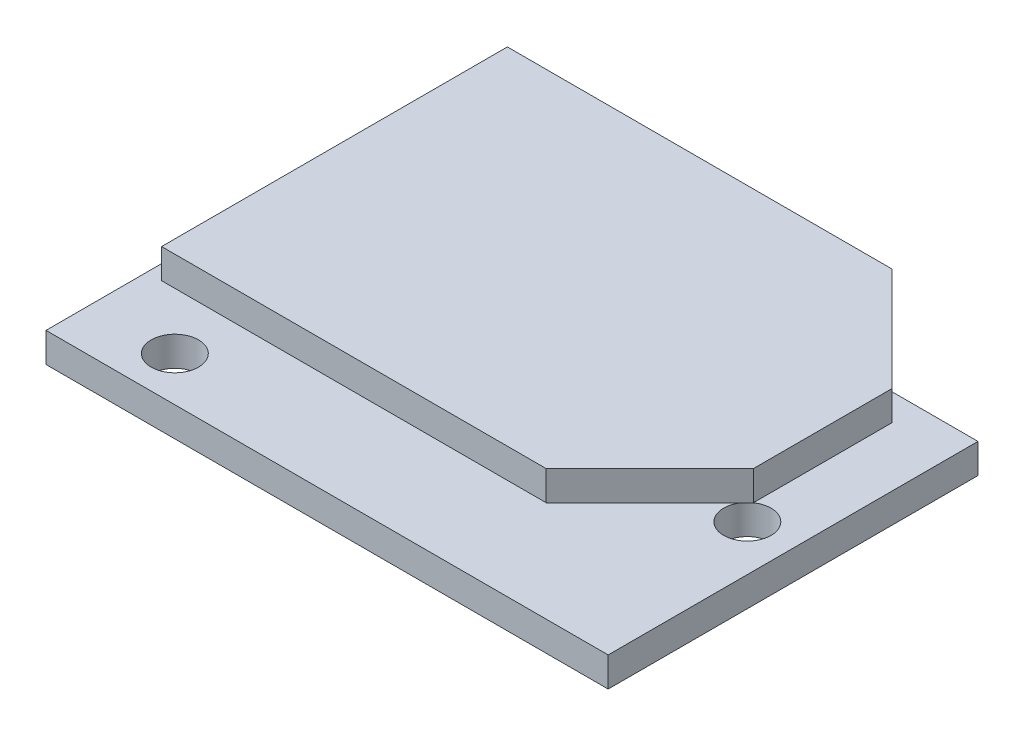
ISO-10303-21;
HEADER;
FILE_DESCRIPTION(('STEP AP214'),'2;1');
FILE_NAME('part.step','',(''),(''),'','','');
FILE_SCHEMA(('AUTOMOTIVE_DESIGN { 1 0 10303 214 1 1 1 1 }'));
ENDSEC;
DATA;
#1=APPLICATION_CONTEXT('core data for automotive mechanical design processes');
#2=APPLICATION_PROTOCOL_DEFINITION('international standard','automotive_design',2000,#1);
#3=PRODUCT_CONTEXT('',#1,'mechanical');
#4=PRODUCT('Part','Part','',(#3));
#5=PRODUCT_RELATED_PRODUCT_CATEGORY('part','',(#4));
#6=PRODUCT_DEFINITION_FORMATION('','',#4);
#7=PRODUCT_DEFINITION_CONTEXT('part definition',#1,'design');
#8=PRODUCT_DEFINITION('design','',#6,#7);
#9=PRODUCT_DEFINITION_SHAPE('','',#8);
#10=(LENGTH_UNIT() NAMED_UNIT(*) SI_UNIT(.MILLI.,.METRE.));
#11=(NAMED_UNIT(*) PLANE_ANGLE_UNIT() SI_UNIT($,.RADIAN.));
#12=(NAMED_UNIT(*) SI_UNIT($,.STERADIAN.) SOLID_ANGLE_UNIT());
#13=UNCERTAINTY_MEASURE_WITH_UNIT(LENGTH_MEASURE(1.E-05),#10,'distance_accuracy_value','');
#14=(GEOMETRIC_REPRESENTATION_CONTEXT(3) GLOBAL_UNCERTAINTY_ASSIGNED_CONTEXT((#13)) GLOBAL_UNIT_ASSIGNED_CONTEXT((#10,
#11,#12)) REPRESENTATION_CONTEXT('',''));
#15=CARTESIAN_POINT('',(0.,0.,0.));
#16=DIRECTION('',(0.,0.,1.));
#17=DIRECTION('',(1.,0.,0.));
#18=AXIS2_PLACEMENT_3D('',#15,#16,#17);
#19=CARTESIAN_POINT('',(7.,10.,-11.6864188731344));
#20=DIRECTION('',(1.,0.,0.));
#21=DIRECTION('',(0.,0.,-1.));
#22=AXIS2_PLACEMENT_3D('',#19,#20,#21);
#23=PLANE('',#22);
#24=DIRECTION('',(0.,0.,1.));
#25=VECTOR('',#24,1.);
#26=CARTESIAN_POINT('',(7.,8.,-11.6864188731344));
#27=LINE('',#26,#25);
#28=CARTESIAN_POINT('',(7.,8.,-11.6864188731344));
#29=VERTEX_POINT('',#28);
#30=CARTESIAN_POINT('',(7.,8.,11.6864188731344));
#31=VERTEX_POINT('',#30);
#32=EDGE_CURVE('E129',#29,#31,#27,.T.);
#33=ORIENTED_EDGE('',*,*,#32,.T.);
#34=DIRECTION('',(0.,-1.,0.));
#35=VECTOR('',#34,1.);
#36=CARTESIAN_POINT('',(7.,10.,11.6864188731344));
#37=LINE('',#36,#35);
#38=CARTESIAN_POINT('',(7.,10.,11.6864188731344));
#39=VERTEX_POINT('',#38);
#40=EDGE_CURVE('E12',#39,#31,#37,.T.);
#41=ORIENTED_EDGE('',*,*,#40,.F.);
#42=DIRECTION('',(0.,0.,1.));
#43=VECTOR('',#42,1.);
#44=CARTESIAN_POINT('',(7.,10.,-11.6864188731344));
#45=LINE('',#44,#43);
#46=CARTESIAN_POINT('',(7.,10.,-11.6864188731344));
#47=VERTEX_POINT('',#46);
#48=EDGE_CURVE('E139',#47,#39,#45,.T.);
#49=ORIENTED_EDGE('',*,*,#48,.F.);
#50=DIRECTION('',(0.,-1.,0.));
#51=VECTOR('',#50,1.);
#52=CARTESIAN_POINT('',(7.,10.,-11.6864188731344));
#53=LINE('',#52,#51);
#54=EDGE_CURVE('E125',#47,#29,#53,.T.);
#55=ORIENTED_EDGE('',*,*,#54,.T.);
#56=EDGE_LOOP('',(#33,#41,#49,#55));
#57=FACE_BOUND('',#56,.T.);
#58=ADVANCED_FACE('F45',(#57),#23,.F.);
#59=CARTESIAN_POINT('',(7.,10.,11.6864188731344));
#60=DIRECTION('',(0.,0.,-1.));
#61=DIRECTION('',(-1.,0.,0.));
#62=AXIS2_PLACEMENT_3D('',#59,#60,#61);
#63=PLANE('',#62);
#64=DIRECTION('',(1.,0.,0.));
#65=VECTOR('',#64,1.);
#66=CARTESIAN_POINT('',(7.,8.,11.6864188731344));
#67=LINE('',#66,#65);
#68=CARTESIAN_POINT('',(33.0000000000001,8.,11.6864188731344));
#69=VERTEX_POINT('',#68);
#70=EDGE_CURVE('E132',#31,#69,#67,.T.);
#71=ORIENTED_EDGE('',*,*,#70,.T.);
#72=DIRECTION('',(0.,-1.,0.));
#73=VECTOR('',#72,1.);
#74=CARTESIAN_POINT('',(33.0000000000001,10.,11.6864188731344));
#75=LINE('',#74,#73);
#76=CARTESIAN_POINT('',(33.0000000000001,10.,11.6864188731344));
#77=VERTEX_POINT('',#76);
#78=EDGE_CURVE('E53',#77,#69,#75,.T.);
#79=ORIENTED_EDGE('',*,*,#78,.F.);
#80=DIRECTION('',(1.,0.,0.));
#81=VECTOR('',#80,1.);
#82=CARTESIAN_POINT('',(7.,10.,11.6864188731344));
#83=LINE('',#82,#81);
#84=EDGE_CURVE('E98',#39,#77,#83,.T.);
#85=ORIENTED_EDGE('',*,*,#84,.F.);
#86=ORIENTED_EDGE('',*,*,#40,.T.);
#87=EDGE_LOOP('',(#71,#79,#85,#86));
#88=FACE_BOUND('',#87,.T.);
#89=ADVANCED_FACE('F163',(#88),#63,.F.);
#90=CARTESIAN_POINT('',(33.0000000000001,10.,11.6864188731344));
#91=DIRECTION('',(-0.707106781186549,0.,-0.707106781186546));
#92=DIRECTION('',(-0.707106781186546,0.,0.707106781186549));
#93=AXIS2_PLACEMENT_3D('',#90,#91,#92);
#94=PLANE('',#93);
#95=DIRECTION('',(0.707106781186546,0.,-0.707106781186549));
#96=VECTOR('',#95,1.);
#97=CARTESIAN_POINT('',(33.0000000000001,8.,11.6864188731344));
#98=LINE('',#97,#96);
#99=CARTESIAN_POINT('',(40.,8.,4.68641887313448));
#100=VERTEX_POINT('',#99);
#101=EDGE_CURVE('E134',#69,#100,#98,.T.);
#102=ORIENTED_EDGE('',*,*,#101,.T.);
#103=DIRECTION('',(0.,-1.,0.));
#104=VECTOR('',#103,1.);
#105=CARTESIAN_POINT('',(40.,10.,4.68641887313448));
#106=LINE('',#105,#104);
#107=CARTESIAN_POINT('',(40.,10.,4.68641887313448));
#108=VERTEX_POINT('',#107);
#109=EDGE_CURVE('E120',#108,#100,#106,.T.);
#110=ORIENTED_EDGE('',*,*,#109,.F.);
#111=DIRECTION('',(0.707106781186546,0.,-0.707106781186549));
#112=VECTOR('',#111,1.);
#113=CARTESIAN_POINT('',(33.0000000000001,10.,11.6864188731344));
#114=LINE('',#113,#112);
#115=EDGE_CURVE('E111',#77,#108,#114,.T.);
#116=ORIENTED_EDGE('',*,*,#115,.F.);
#117=ORIENTED_EDGE('',*,*,#78,.T.);
#118=EDGE_LOOP('',(#102,#110,#116,#117));
#119=FACE_BOUND('',#118,.T.);
#120=ADVANCED_FACE('F145',(#119),#94,.F.);
#121=CARTESIAN_POINT('',(40.,10.,4.68641887313448));
#122=DIRECTION('',(-1.,0.,0.));
#123=DIRECTION('',(0.,0.,1.));
#124=AXIS2_PLACEMENT_3D('',#121,#122,#123);
#125=PLANE('',#124);
#126=DIRECTION('',(0.,0.,-1.));
#127=VECTOR('',#126,1.);
#128=CARTESIAN_POINT('',(40.,8.,4.68641887313448));
#129=LINE('',#128,#127);
#130=CARTESIAN_POINT('',(40.,8.,-4.68641887313448));
#131=VERTEX_POINT('',#130);
#132=EDGE_CURVE('E119',#100,#131,#129,.T.);
#133=ORIENTED_EDGE('',*,*,#132,.T.);
#134=DIRECTION('',(0.,-1.,0.));
#135=VECTOR('',#134,1.);
#136=CARTESIAN_POINT('',(40.,10.,-4.68641887313448));
#137=LINE('',#136,#135);
#138=CARTESIAN_POINT('',(40.,10.,-4.68641887313448));
#139=VERTEX_POINT('',#138);
#140=EDGE_CURVE('E116',#139,#131,#137,.T.);
#141=ORIENTED_EDGE('',*,*,#140,.F.);
#142=DIRECTION('',(0.,0.,-1.));
#143=VECTOR('',#142,1.);
#144=CARTESIAN_POINT('',(40.,10.,4.68641887313448));
#145=LINE('',#144,#143);
#146=EDGE_CURVE('E105',#108,#139,#145,.T.);
#147=ORIENTED_EDGE('',*,*,#146,.F.);
#148=ORIENTED_EDGE('',*,*,#109,.T.);
#149=EDGE_LOOP('',(#133,#141,#147,#148));
#150=FACE_BOUND('',#149,.T.);
#151=ADVANCED_FACE('F117',(#150),#125,.F.);
#152=CARTESIAN_POINT('',(40.,10.,-4.68641887313448));
#153=DIRECTION('',(-0.707106781186544,0.,0.707106781186551));
#154=DIRECTION('',(0.707106781186551,0.,0.707106781186544));
#155=AXIS2_PLACEMENT_3D('',#152,#153,#154);
#156=PLANE('',#155);
#157=DIRECTION('',(-0.707106781186551,0.,-0.707106781186544));
#158=VECTOR('',#157,1.);
#159=CARTESIAN_POINT('',(40.,8.,-4.68641887313448));
#160=LINE('',#159,#158);
#161=CARTESIAN_POINT('',(33.,8.,-11.6864188731344));
#162=VERTEX_POINT('',#161);
#163=EDGE_CURVE('E84',#131,#162,#160,.T.);
#164=ORIENTED_EDGE('',*,*,#163,.T.);
#165=DIRECTION('',(0.,-1.,0.));
#166=VECTOR('',#165,1.);
#167=CARTESIAN_POINT('',(33.,10.,-11.6864188731344));
#168=LINE('',#167,#166);
#169=CARTESIAN_POINT('',(33.,10.,-11.6864188731344));
#170=VERTEX_POINT('',#169);
#171=EDGE_CURVE('E121',#170,#162,#168,.T.);
#172=ORIENTED_EDGE('',*,*,#171,.F.);
#173=DIRECTION('',(-0.707106781186551,0.,-0.707106781186544));
#174=VECTOR('',#173,1.);
#175=CARTESIAN_POINT('',(40.,10.,-4.68641887313448));
#176=LINE('',#175,#174);
#177=EDGE_CURVE('E109',#139,#170,#176,.T.);
#178=ORIENTED_EDGE('',*,*,#177,.F.);
#179=ORIENTED_EDGE('',*,*,#140,.T.);
#180=EDGE_LOOP('',(#164,#172,#178,#179));
#181=FACE_BOUND('',#180,.T.);
#182=ADVANCED_FACE('F123',(#181),#156,.F.);
#183=CARTESIAN_POINT('',(7.,10.,-11.6864188731344));
#184=DIRECTION('',(0.,0.,1.));
#185=DIRECTION('',(1.,0.,0.));
#186=AXIS2_PLACEMENT_3D('',#183,#184,#185);
#187=PLANE('',#186);
#188=DIRECTION('',(-1.,0.,0.));
#189=VECTOR('',#188,1.);
#190=CARTESIAN_POINT('',(7.,8.,-11.6864188731344));
#191=LINE('',#190,#189);
#192=EDGE_CURVE('E90',#162,#29,#191,.T.);
#193=ORIENTED_EDGE('',*,*,#192,.T.);
#194=ORIENTED_EDGE('',*,*,#54,.F.);
#195=DIRECTION('',(-1.,0.,0.));
#196=VECTOR('',#195,1.);
#197=CARTESIAN_POINT('',(7.,10.,-11.6864188731344));
#198=LINE('',#197,#196);
#199=EDGE_CURVE('E61',#170,#47,#198,.T.);
#200=ORIENTED_EDGE('',*,*,#199,.F.);
#201=ORIENTED_EDGE('',*,*,#171,.T.);
#202=EDGE_LOOP('',(#193,#194,#200,#201));
#203=FACE_BOUND('',#202,.T.);
#204=ADVANCED_FACE('F152',(#203),#187,.F.);
#205=CARTESIAN_POINT('',(0.,10.,0.));
#206=DIRECTION('',(0.,1.,0.));
#207=DIRECTION('',(0.,0.,1.));
#208=AXIS2_PLACEMENT_3D('',#205,#206,#207);
#209=PLANE('',#208);
#210=ORIENTED_EDGE('',*,*,#48,.T.);
#211=ORIENTED_EDGE('',*,*,#84,.T.);
#212=ORIENTED_EDGE('',*,*,#115,.T.);
#213=ORIENTED_EDGE('',*,*,#146,.T.);
#214=ORIENTED_EDGE('',*,*,#177,.T.);
#215=ORIENTED_EDGE('',*,*,#199,.T.);
#216=EDGE_LOOP('',(#210,#211,#212,#213,#214,#215));
#217=FACE_BOUND('',#216,.T.);
#218=ADVANCED_FACE('F107',(#217),#209,.T.);
#219=CARTESIAN_POINT('',(0.,8.,0.));
#220=DIRECTION('',(0.,1.,0.));
#221=DIRECTION('',(0.,0.,1.));
#222=AXIS2_PLACEMENT_3D('',#219,#220,#221);
#223=PLANE('',#222);
#224=ORIENTED_EDGE('',*,*,#32,.F.);
#225=ORIENTED_EDGE('',*,*,#192,.F.);
#226=ORIENTED_EDGE('',*,*,#163,.F.);
#227=ORIENTED_EDGE('',*,*,#132,.F.);
#228=ORIENTED_EDGE('',*,*,#101,.F.);
#229=ORIENTED_EDGE('',*,*,#70,.F.);
#230=EDGE_LOOP('',(#224,#225,#226,#227,#228,#229));
#231=FACE_BOUND('',#230,.T.);
#232=ADVANCED_FACE('F148',(#231),#223,.F.);
#233=CLOSED_SHELL('',(#58,#89,#120,#151,#182,#204,#218,#232));
#234=MANIFOLD_SOLID_BREP('B2',#233);
#235=CARTESIAN_POINT('',(0.,2.,0.));
#236=DIRECTION('',(0.,1.,0.));
#237=DIRECTION('',(0.,0.,1.));
#238=AXIS2_PLACEMENT_3D('',#235,#236,#237);
#239=PLANE('',#238);
#240=CARTESIAN_POINT('',(5.71,2.,9.5));
#241=DIRECTION('',(0.,1.,0.));
#242=DIRECTION('',(0.,0.,-1.));
#243=AXIS2_PLACEMENT_3D('',#240,#241,#242);
#244=CIRCLE('',#243,1.6);
#245=CARTESIAN_POINT('',(5.71,2.,7.9));
#246=VERTEX_POINT('',#245);
#247=EDGE_CURVE('E303',#246,#246,#244,.T.);
#248=ORIENTED_EDGE('',*,*,#247,.F.);
#249=EDGE_LOOP('',(#248));
#250=FACE_BOUND('',#249,.T.);
#251=DIRECTION('',(0.,0.,1.));
#252=VECTOR('',#251,1.);
#253=CARTESIAN_POINT('',(0.,2.,-12.5));
#254=LINE('',#253,#252);
#255=CARTESIAN_POINT('',(0.,2.,-12.5));
#256=VERTEX_POINT('',#255);
#257=CARTESIAN_POINT('',(0.,2.,12.5));
#258=VERTEX_POINT('',#257);
#259=EDGE_CURVE('E273',#256,#258,#254,.T.);
#260=ORIENTED_EDGE('',*,*,#259,.T.);
#261=DIRECTION('',(1.,0.,0.));
#262=VECTOR('',#261,1.);
#263=CARTESIAN_POINT('',(0.,2.,12.5));
#264=LINE('',#263,#262);
#265=CARTESIAN_POINT('',(38.,2.,12.5));
#266=VERTEX_POINT('',#265);
#267=EDGE_CURVE('E268',#258,#266,#264,.T.);
#268=ORIENTED_EDGE('',*,*,#267,.T.);
#269=DIRECTION('',(0.,0.,-1.));
#270=VECTOR('',#269,1.);
#271=CARTESIAN_POINT('',(38.,2.,-12.5));
#272=LINE('',#271,#270);
#273=CARTESIAN_POINT('',(38.,2.,-12.5));
#274=VERTEX_POINT('',#273);
#275=EDGE_CURVE('E271',#266,#274,#272,.T.);
#276=ORIENTED_EDGE('',*,*,#275,.T.);
#277=DIRECTION('',(-1.,0.,0.));
#278=VECTOR('',#277,1.);
#279=CARTESIAN_POINT('',(0.,2.,-12.5));
#280=LINE('',#279,#278);
#281=EDGE_CURVE('E238',#274,#256,#280,.T.);
#282=ORIENTED_EDGE('',*,*,#281,.T.);
#283=EDGE_LOOP('',(#260,#268,#276,#282));
#284=FACE_BOUND('',#283,.T.);
#285=CARTESIAN_POINT('',(5.71,2.,-9.5));
#286=DIRECTION('',(0.,1.,0.));
#287=DIRECTION('',(0.,0.,1.));
#288=AXIS2_PLACEMENT_3D('',#285,#286,#287);
#289=CIRCLE('',#288,1.6);
#290=CARTESIAN_POINT('',(5.71,2.,-7.9));
#291=VERTEX_POINT('',#290);
#292=EDGE_CURVE('E288',#291,#291,#289,.T.);
#293=ORIENTED_EDGE('',*,*,#292,.F.);
#294=EDGE_LOOP('',(#293));
#295=FACE_BOUND('',#294,.T.);
#296=CARTESIAN_POINT('',(34.91,2.,0.));
#297=DIRECTION('',(0.,1.,0.));
#298=DIRECTION('',(0.,0.,1.));
#299=AXIS2_PLACEMENT_3D('',#296,#297,#298);
#300=CIRCLE('',#299,1.6);
#301=CARTESIAN_POINT('',(34.91,2.,1.6));
#302=VERTEX_POINT('',#301);
#303=EDGE_CURVE('E309',#302,#302,#300,.T.);
#304=ORIENTED_EDGE('',*,*,#303,.F.);
#305=EDGE_LOOP('',(#304));
#306=FACE_BOUND('',#305,.T.);
#307=ADVANCED_FACE('F221',(#250,#284,#295,#306),#239,.T.);
#308=CARTESIAN_POINT('',(0.,0.,0.));
#309=DIRECTION('',(0.,1.,0.));
#310=DIRECTION('',(0.,0.,1.));
#311=AXIS2_PLACEMENT_3D('',#308,#309,#310);
#312=PLANE('',#311);
#313=DIRECTION('',(0.,0.,1.));
#314=VECTOR('',#313,1.);
#315=CARTESIAN_POINT('',(0.,0.,-12.5));
#316=LINE('',#315,#314);
#317=CARTESIAN_POINT('',(0.,0.,-12.5));
#318=VERTEX_POINT('',#317);
#319=CARTESIAN_POINT('',(0.,0.,12.5));
#320=VERTEX_POINT('',#319);
#321=EDGE_CURVE('E285',#318,#320,#316,.T.);
#322=ORIENTED_EDGE('',*,*,#321,.F.);
#323=DIRECTION('',(-1.,0.,0.));
#324=VECTOR('',#323,1.);
#325=CARTESIAN_POINT('',(0.,0.,-12.5));
#326=LINE('',#325,#324);
#327=CARTESIAN_POINT('',(38.,0.,-12.5));
#328=VERTEX_POINT('',#327);
#329=EDGE_CURVE('E261',#328,#318,#326,.T.);
#330=ORIENTED_EDGE('',*,*,#329,.F.);
#331=DIRECTION('',(0.,0.,-1.));
#332=VECTOR('',#331,1.);
#333=CARTESIAN_POINT('',(38.,0.,-12.5));
#334=LINE('',#333,#332);
#335=CARTESIAN_POINT('',(38.,0.,12.5));
#336=VERTEX_POINT('',#335);
#337=EDGE_CURVE('E255',#336,#328,#334,.T.);
#338=ORIENTED_EDGE('',*,*,#337,.F.);
#339=DIRECTION('',(1.,0.,0.));
#340=VECTOR('',#339,1.);
#341=CARTESIAN_POINT('',(0.,0.,12.5));
#342=LINE('',#341,#340);
#343=EDGE_CURVE('E277',#320,#336,#342,.T.);
#344=ORIENTED_EDGE('',*,*,#343,.F.);
#345=EDGE_LOOP('',(#322,#330,#338,#344));
#346=FACE_BOUND('',#345,.T.);
#347=CARTESIAN_POINT('',(5.71,0.,-9.5));
#348=DIRECTION('',(0.,1.,0.));
#349=DIRECTION('',(0.,0.,1.));
#350=AXIS2_PLACEMENT_3D('',#347,#348,#349);
#351=CIRCLE('',#350,1.6);
#352=CARTESIAN_POINT('',(5.71,0.,-7.9));
#353=VERTEX_POINT('',#352);
#354=EDGE_CURVE('E300',#353,#353,#351,.T.);
#355=ORIENTED_EDGE('',*,*,#354,.T.);
#356=EDGE_LOOP('',(#355));
#357=FACE_BOUND('',#356,.T.);
#358=CARTESIAN_POINT('',(5.71,0.,9.5));
#359=DIRECTION('',(0.,1.,0.));
#360=DIRECTION('',(0.,0.,-1.));
#361=AXIS2_PLACEMENT_3D('',#358,#359,#360);
#362=CIRCLE('',#361,1.6);
#363=CARTESIAN_POINT('',(5.71,0.,7.9));
#364=VERTEX_POINT('',#363);
#365=EDGE_CURVE('E306',#364,#364,#362,.T.);
#366=ORIENTED_EDGE('',*,*,#365,.T.);
#367=EDGE_LOOP('',(#366));
#368=FACE_BOUND('',#367,.T.);
#369=CARTESIAN_POINT('',(34.91,0.,0.));
#370=DIRECTION('',(0.,1.,0.));
#371=DIRECTION('',(0.,0.,1.));
#372=AXIS2_PLACEMENT_3D('',#369,#370,#371);
#373=CIRCLE('',#372,1.6);
#374=CARTESIAN_POINT('',(34.91,0.,1.6));
#375=VERTEX_POINT('',#374);
#376=EDGE_CURVE('E312',#375,#375,#373,.T.);
#377=ORIENTED_EDGE('',*,*,#376,.T.);
#378=EDGE_LOOP('',(#377));
#379=FACE_BOUND('',#378,.T.);
#380=ADVANCED_FACE('F296',(#346,#357,#368,#379),#312,.F.);
#381=CARTESIAN_POINT('',(0.,2.,-12.5));
#382=DIRECTION('',(1.,0.,0.));
#383=DIRECTION('',(0.,0.,-1.));
#384=AXIS2_PLACEMENT_3D('',#381,#382,#383);
#385=PLANE('',#384);
#386=ORIENTED_EDGE('',*,*,#321,.T.);
#387=DIRECTION('',(0.,-1.,0.));
#388=VECTOR('',#387,1.);
#389=CARTESIAN_POINT('',(0.,2.,12.5));
#390=LINE('',#389,#388);
#391=EDGE_CURVE('E43',#258,#320,#390,.T.);
#392=ORIENTED_EDGE('',*,*,#391,.F.);
#393=ORIENTED_EDGE('',*,*,#259,.F.);
#394=DIRECTION('',(0.,-1.,0.));
#395=VECTOR('',#394,1.);
#396=CARTESIAN_POINT('',(0.,2.,-12.5));
#397=LINE('',#396,#395);
#398=EDGE_CURVE('E281',#256,#318,#397,.T.);
#399=ORIENTED_EDGE('',*,*,#398,.T.);
#400=EDGE_LOOP('',(#386,#392,#393,#399));
#401=FACE_BOUND('',#400,.T.);
#402=ADVANCED_FACE('F223',(#401),#385,.F.);
#403=CARTESIAN_POINT('',(0.,2.,12.5));
#404=DIRECTION('',(0.,0.,-1.));
#405=DIRECTION('',(-1.,0.,0.));
#406=AXIS2_PLACEMENT_3D('',#403,#404,#405);
#407=PLANE('',#406);
#408=ORIENTED_EDGE('',*,*,#343,.T.);
#409=DIRECTION('',(0.,-1.,0.));
#410=VECTOR('',#409,1.);
#411=CARTESIAN_POINT('',(38.,2.,12.5));
#412=LINE('',#411,#410);
#413=EDGE_CURVE('E230',#266,#336,#412,.T.);
#414=ORIENTED_EDGE('',*,*,#413,.F.);
#415=ORIENTED_EDGE('',*,*,#267,.F.);
#416=ORIENTED_EDGE('',*,*,#391,.T.);
#417=EDGE_LOOP('',(#408,#414,#415,#416));
#418=FACE_BOUND('',#417,.T.);
#419=ADVANCED_FACE('F276',(#418),#407,.F.);
#420=CARTESIAN_POINT('',(38.,2.,-12.5));
#421=DIRECTION('',(-1.,0.,0.));
#422=DIRECTION('',(0.,0.,1.));
#423=AXIS2_PLACEMENT_3D('',#420,#421,#422);
#424=PLANE('',#423);
#425=ORIENTED_EDGE('',*,*,#337,.T.);
#426=DIRECTION('',(0.,-1.,0.));
#427=VECTOR('',#426,1.);
#428=CARTESIAN_POINT('',(38.,2.,-12.5));
#429=LINE('',#428,#427);
#430=EDGE_CURVE('E278',#274,#328,#429,.T.);
#431=ORIENTED_EDGE('',*,*,#430,.F.);
#432=ORIENTED_EDGE('',*,*,#275,.F.);
#433=ORIENTED_EDGE('',*,*,#413,.T.);
#434=EDGE_LOOP('',(#425,#431,#432,#433));
#435=FACE_BOUND('',#434,.T.);
#436=ADVANCED_FACE('F279',(#435),#424,.F.);
#437=CARTESIAN_POINT('',(0.,2.,-12.5));
#438=DIRECTION('',(0.,0.,1.));
#439=DIRECTION('',(1.,0.,0.));
#440=AXIS2_PLACEMENT_3D('',#437,#438,#439);
#441=PLANE('',#440);
#442=ORIENTED_EDGE('',*,*,#329,.T.);
#443=ORIENTED_EDGE('',*,*,#398,.F.);
#444=ORIENTED_EDGE('',*,*,#281,.F.);
#445=ORIENTED_EDGE('',*,*,#430,.T.);
#446=EDGE_LOOP('',(#442,#443,#444,#445));
#447=FACE_BOUND('',#446,.T.);
#448=ADVANCED_FACE('F293',(#447),#441,.F.);
#449=CARTESIAN_POINT('',(5.71,2.,-9.5));
#450=DIRECTION('',(0.,-1.,0.));
#451=DIRECTION('',(0.,0.,-1.));
#452=AXIS2_PLACEMENT_3D('',#449,#450,#451);
#453=CYLINDRICAL_SURFACE('',#452,1.6);
#454=ORIENTED_EDGE('',*,*,#292,.T.);
#455=EDGE_LOOP('',(#454));
#456=FACE_BOUND('',#455,.T.);
#457=ORIENTED_EDGE('',*,*,#354,.F.);
#458=EDGE_LOOP('',(#457));
#459=FACE_BOUND('',#458,.T.);
#460=ADVANCED_FACE('F330',(#456,#459),#453,.F.);
#461=CARTESIAN_POINT('',(5.71,2.,9.5));
#462=DIRECTION('',(0.,-1.,0.));
#463=DIRECTION('',(0.,0.,-1.));
#464=AXIS2_PLACEMENT_3D('',#461,#462,#463);
#465=CYLINDRICAL_SURFACE('',#464,1.6);
#466=ORIENTED_EDGE('',*,*,#247,.T.);
#467=EDGE_LOOP('',(#466));
#468=FACE_BOUND('',#467,.T.);
#469=ORIENTED_EDGE('',*,*,#365,.F.);
#470=EDGE_LOOP('',(#469));
#471=FACE_BOUND('',#470,.T.);
#472=ADVANCED_FACE('F376',(#468,#471),#465,.F.);
#473=CARTESIAN_POINT('',(34.91,2.,0.));
#474=DIRECTION('',(0.,-1.,0.));
#475=DIRECTION('',(0.,0.,-1.));
#476=AXIS2_PLACEMENT_3D('',#473,#474,#475);
#477=CYLINDRICAL_SURFACE('',#476,1.6);
#478=ORIENTED_EDGE('',*,*,#303,.T.);
#479=EDGE_LOOP('',(#478));
#480=FACE_BOUND('',#479,.T.);
#481=ORIENTED_EDGE('',*,*,#376,.F.);
#482=EDGE_LOOP('',(#481));
#483=FACE_BOUND('',#482,.T.);
#484=ADVANCED_FACE('F318',(#480,#483),#477,.F.);
#485=CLOSED_SHELL('',(#307,#380,#402,#419,#436,#448,#460,#472,#484));
#486=MANIFOLD_SOLID_BREP('B6',#485);
#487=ADVANCED_BREP_SHAPE_REPRESENTATION('',(#18,#234,#486),#14);
#488=SHAPE_DEFINITION_REPRESENTATION(#9,#487);
ENDSEC;
END-ISO-10303-21;
